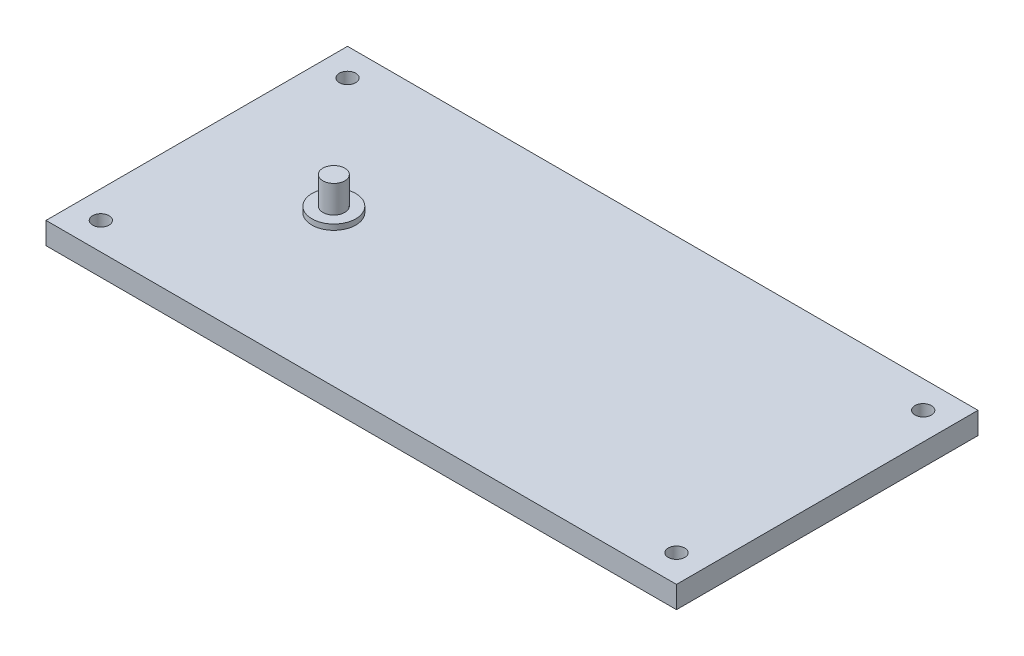
ISO-10303-21;
HEADER;
FILE_DESCRIPTION(('STEP AP214'),'2;1');
FILE_NAME('part.step','',(''),(''),'','','');
FILE_SCHEMA(('AUTOMOTIVE_DESIGN { 1 0 10303 214 1 1 1 1 }'));
ENDSEC;
DATA;
#1=APPLICATION_CONTEXT('core data for automotive mechanical design processes');
#2=APPLICATION_PROTOCOL_DEFINITION('international standard','automotive_design',2000,#1);
#3=PRODUCT_CONTEXT('',#1,'mechanical');
#4=PRODUCT('Part','Part','',(#3));
#5=PRODUCT_RELATED_PRODUCT_CATEGORY('part','',(#4));
#6=PRODUCT_DEFINITION_FORMATION('','',#4);
#7=PRODUCT_DEFINITION_CONTEXT('part definition',#1,'design');
#8=PRODUCT_DEFINITION('design','',#6,#7);
#9=PRODUCT_DEFINITION_SHAPE('','',#8);
#10=(LENGTH_UNIT() NAMED_UNIT(*) SI_UNIT(.MILLI.,.METRE.));
#11=(NAMED_UNIT(*) PLANE_ANGLE_UNIT() SI_UNIT($,.RADIAN.));
#12=(NAMED_UNIT(*) SI_UNIT($,.STERADIAN.) SOLID_ANGLE_UNIT());
#13=UNCERTAINTY_MEASURE_WITH_UNIT(LENGTH_MEASURE(1.E-05),#10,'distance_accuracy_value','');
#14=(GEOMETRIC_REPRESENTATION_CONTEXT(3) GLOBAL_UNCERTAINTY_ASSIGNED_CONTEXT((#13)) GLOBAL_UNIT_ASSIGNED_CONTEXT((#10,
#11,#12)) REPRESENTATION_CONTEXT('',''));
#15=CARTESIAN_POINT('',(0.,0.,0.));
#16=DIRECTION('',(0.,0.,1.));
#17=DIRECTION('',(1.,0.,0.));
#18=AXIS2_PLACEMENT_3D('',#15,#16,#17);
#19=CARTESIAN_POINT('',(115.,8.,-55.));
#20=DIRECTION('',(-1.,0.,0.));
#21=DIRECTION('',(0.,0.,1.));
#22=AXIS2_PLACEMENT_3D('',#19,#20,#21);
#23=PLANE('',#22);
#24=DIRECTION('',(0.,0.,-1.));
#25=VECTOR('',#24,1.);
#26=CARTESIAN_POINT('',(115.,0.,-55.));
#27=LINE('',#26,#25);
#28=CARTESIAN_POINT('',(115.,0.,55.));
#29=VERTEX_POINT('',#28);
#30=CARTESIAN_POINT('',(115.,0.,-55.));
#31=VERTEX_POINT('',#30);
#32=EDGE_CURVE('E101',#29,#31,#27,.T.);
#33=ORIENTED_EDGE('',*,*,#32,.T.);
#34=DIRECTION('',(0.,-1.,0.));
#35=VECTOR('',#34,1.);
#36=CARTESIAN_POINT('',(115.,8.,-55.));
#37=LINE('',#36,#35);
#38=CARTESIAN_POINT('',(115.,8.,-55.));
#39=VERTEX_POINT('',#38);
#40=EDGE_CURVE('E38',#39,#31,#37,.T.);
#41=ORIENTED_EDGE('',*,*,#40,.F.);
#42=DIRECTION('',(0.,0.,-1.));
#43=VECTOR('',#42,1.);
#44=CARTESIAN_POINT('',(115.,8.,-55.));
#45=LINE('',#44,#43);
#46=CARTESIAN_POINT('',(115.,8.,55.));
#47=VERTEX_POINT('',#46);
#48=EDGE_CURVE('E88',#47,#39,#45,.T.);
#49=ORIENTED_EDGE('',*,*,#48,.F.);
#50=DIRECTION('',(0.,-1.,0.));
#51=VECTOR('',#50,1.);
#52=CARTESIAN_POINT('',(115.,8.,55.));
#53=LINE('',#52,#51);
#54=EDGE_CURVE('E97',#47,#29,#53,.T.);
#55=ORIENTED_EDGE('',*,*,#54,.T.);
#56=EDGE_LOOP('',(#33,#41,#49,#55));
#57=FACE_BOUND('',#56,.T.);
#58=ADVANCED_FACE('F35',(#57),#23,.F.);
#59=CARTESIAN_POINT('',(-115.,8.,-55.));
#60=DIRECTION('',(0.,0.,1.));
#61=DIRECTION('',(1.,0.,0.));
#62=AXIS2_PLACEMENT_3D('',#59,#60,#61);
#63=PLANE('',#62);
#64=DIRECTION('',(-1.,0.,0.));
#65=VECTOR('',#64,1.);
#66=CARTESIAN_POINT('',(-115.,0.,-55.));
#67=LINE('',#66,#65);
#68=CARTESIAN_POINT('',(-115.,0.,-55.));
#69=VERTEX_POINT('',#68);
#70=EDGE_CURVE('E93',#31,#69,#67,.T.);
#71=ORIENTED_EDGE('',*,*,#70,.T.);
#72=DIRECTION('',(0.,-1.,0.));
#73=VECTOR('',#72,1.);
#74=CARTESIAN_POINT('',(-115.,8.,-55.));
#75=LINE('',#74,#73);
#76=CARTESIAN_POINT('',(-115.,8.,-55.));
#77=VERTEX_POINT('',#76);
#78=EDGE_CURVE('E91',#77,#69,#75,.T.);
#79=ORIENTED_EDGE('',*,*,#78,.F.);
#80=DIRECTION('',(-1.,0.,0.));
#81=VECTOR('',#80,1.);
#82=CARTESIAN_POINT('',(-115.,8.,-55.));
#83=LINE('',#82,#81);
#84=EDGE_CURVE('E83',#39,#77,#83,.T.);
#85=ORIENTED_EDGE('',*,*,#84,.F.);
#86=ORIENTED_EDGE('',*,*,#40,.T.);
#87=EDGE_LOOP('',(#71,#79,#85,#86));
#88=FACE_BOUND('',#87,.T.);
#89=ADVANCED_FACE('F92',(#88),#63,.F.);
#90=CARTESIAN_POINT('',(-115.,8.,-55.));
#91=DIRECTION('',(1.,0.,0.));
#92=DIRECTION('',(0.,0.,-1.));
#93=AXIS2_PLACEMENT_3D('',#90,#91,#92);
#94=PLANE('',#93);
#95=DIRECTION('',(0.,0.,1.));
#96=VECTOR('',#95,1.);
#97=CARTESIAN_POINT('',(-115.,0.,-55.));
#98=LINE('',#97,#96);
#99=CARTESIAN_POINT('',(-115.,0.,55.));
#100=VERTEX_POINT('',#99);
#101=EDGE_CURVE('E69',#69,#100,#98,.T.);
#102=ORIENTED_EDGE('',*,*,#101,.T.);
#103=DIRECTION('',(0.,-1.,0.));
#104=VECTOR('',#103,1.);
#105=CARTESIAN_POINT('',(-115.,8.,55.));
#106=LINE('',#105,#104);
#107=CARTESIAN_POINT('',(-115.,8.,55.));
#108=VERTEX_POINT('',#107);
#109=EDGE_CURVE('E94',#108,#100,#106,.T.);
#110=ORIENTED_EDGE('',*,*,#109,.F.);
#111=DIRECTION('',(0.,0.,1.));
#112=VECTOR('',#111,1.);
#113=CARTESIAN_POINT('',(-115.,8.,-55.));
#114=LINE('',#113,#112);
#115=EDGE_CURVE('E86',#77,#108,#114,.T.);
#116=ORIENTED_EDGE('',*,*,#115,.F.);
#117=ORIENTED_EDGE('',*,*,#78,.T.);
#118=EDGE_LOOP('',(#102,#110,#116,#117));
#119=FACE_BOUND('',#118,.T.);
#120=ADVANCED_FACE('F95',(#119),#94,.F.);
#121=CARTESIAN_POINT('',(-115.,8.,55.));
#122=DIRECTION('',(0.,0.,-1.));
#123=DIRECTION('',(-1.,0.,0.));
#124=AXIS2_PLACEMENT_3D('',#121,#122,#123);
#125=PLANE('',#124);
#126=DIRECTION('',(1.,0.,0.));
#127=VECTOR('',#126,1.);
#128=CARTESIAN_POINT('',(-115.,0.,55.));
#129=LINE('',#128,#127);
#130=EDGE_CURVE('E75',#100,#29,#129,.T.);
#131=ORIENTED_EDGE('',*,*,#130,.T.);
#132=ORIENTED_EDGE('',*,*,#54,.F.);
#133=DIRECTION('',(1.,0.,0.));
#134=VECTOR('',#133,1.);
#135=CARTESIAN_POINT('',(-115.,8.,55.));
#136=LINE('',#135,#134);
#137=EDGE_CURVE('E52',#108,#47,#136,.T.);
#138=ORIENTED_EDGE('',*,*,#137,.F.);
#139=ORIENTED_EDGE('',*,*,#109,.T.);
#140=EDGE_LOOP('',(#131,#132,#138,#139));
#141=FACE_BOUND('',#140,.T.);
#142=ADVANCED_FACE('F109',(#141),#125,.F.);
#143=CARTESIAN_POINT('',(0.,8.,0.));
#144=DIRECTION('',(0.,1.,0.));
#145=DIRECTION('',(0.,0.,1.));
#146=AXIS2_PLACEMENT_3D('',#143,#144,#145);
#147=PLANE('',#146);
#148=CARTESIAN_POINT('',(-105.,8.,45.));
#149=DIRECTION('',(0.,1.,0.));
#150=DIRECTION('',(0.,0.,1.));
#151=AXIS2_PLACEMENT_3D('',#148,#149,#150);
#152=CIRCLE('',#151,3.00000000000001);
#153=CARTESIAN_POINT('',(-105.,8.,48.));
#154=VERTEX_POINT('',#153);
#155=EDGE_CURVE('E137',#154,#154,#152,.T.);
#156=ORIENTED_EDGE('',*,*,#155,.F.);
#157=EDGE_LOOP('',(#156));
#158=FACE_BOUND('',#157,.T.);
#159=CARTESIAN_POINT('',(105.,8.,-45.));
#160=DIRECTION('',(0.,1.,0.));
#161=DIRECTION('',(0.,0.,1.));
#162=AXIS2_PLACEMENT_3D('',#159,#160,#161);
#163=CIRCLE('',#162,3.00000000000001);
#164=CARTESIAN_POINT('',(105.,8.,-42.));
#165=VERTEX_POINT('',#164);
#166=EDGE_CURVE('E130',#165,#165,#163,.T.);
#167=ORIENTED_EDGE('',*,*,#166,.F.);
#168=EDGE_LOOP('',(#167));
#169=FACE_BOUND('',#168,.T.);
#170=CARTESIAN_POINT('',(105.,8.,45.));
#171=DIRECTION('',(0.,1.,0.));
#172=DIRECTION('',(0.,0.,1.));
#173=AXIS2_PLACEMENT_3D('',#170,#171,#172);
#174=CIRCLE('',#173,3.00000000000001);
#175=CARTESIAN_POINT('',(105.,8.,48.));
#176=VERTEX_POINT('',#175);
#177=EDGE_CURVE('E142',#176,#176,#174,.T.);
#178=ORIENTED_EDGE('',*,*,#177,.F.);
#179=EDGE_LOOP('',(#178));
#180=FACE_BOUND('',#179,.T.);
#181=CARTESIAN_POINT('',(-105.,8.,-45.));
#182=DIRECTION('',(0.,1.,0.));
#183=DIRECTION('',(0.,0.,1.));
#184=AXIS2_PLACEMENT_3D('',#181,#182,#183);
#185=CIRCLE('',#184,3.00000000000001);
#186=CARTESIAN_POINT('',(-105.,8.,-42.));
#187=VERTEX_POINT('',#186);
#188=EDGE_CURVE('E124',#187,#187,#185,.T.);
#189=ORIENTED_EDGE('',*,*,#188,.F.);
#190=EDGE_LOOP('',(#189));
#191=FACE_BOUND('',#190,.T.);
#192=CARTESIAN_POINT('',(-65.,8.,0.));
#193=DIRECTION('',(0.,1.,0.));
#194=DIRECTION('',(0.,0.,1.));
#195=AXIS2_PLACEMENT_3D('',#192,#193,#194);
#196=CIRCLE('',#195,8.);
#197=CARTESIAN_POINT('',(-65.,8.,8.));
#198=VERTEX_POINT('',#197);
#199=EDGE_CURVE('E115',#198,#198,#196,.T.);
#200=ORIENTED_EDGE('',*,*,#199,.F.);
#201=EDGE_LOOP('',(#200));
#202=FACE_BOUND('',#201,.T.);
#203=ORIENTED_EDGE('',*,*,#48,.T.);
#204=ORIENTED_EDGE('',*,*,#84,.T.);
#205=ORIENTED_EDGE('',*,*,#115,.T.);
#206=ORIENTED_EDGE('',*,*,#137,.T.);
#207=EDGE_LOOP('',(#203,#204,#205,#206));
#208=FACE_BOUND('',#207,.T.);
#209=ADVANCED_FACE('F84',(#158,#169,#180,#191,#202,#208),#147,.T.);
#210=CARTESIAN_POINT('',(0.,0.,0.));
#211=DIRECTION('',(0.,1.,0.));
#212=DIRECTION('',(0.,0.,1.));
#213=AXIS2_PLACEMENT_3D('',#210,#211,#212);
#214=PLANE('',#213);
#215=CARTESIAN_POINT('',(-105.,0.,45.));
#216=DIRECTION('',(0.,1.,0.));
#217=DIRECTION('',(0.,0.,1.));
#218=AXIS2_PLACEMENT_3D('',#215,#216,#217);
#219=CIRCLE('',#218,3.00000000000001);
#220=CARTESIAN_POINT('',(-105.,0.,48.));
#221=VERTEX_POINT('',#220);
#222=EDGE_CURVE('E127',#221,#221,#219,.T.);
#223=ORIENTED_EDGE('',*,*,#222,.T.);
#224=EDGE_LOOP('',(#223));
#225=FACE_BOUND('',#224,.T.);
#226=CARTESIAN_POINT('',(105.,0.,-45.));
#227=DIRECTION('',(0.,1.,0.));
#228=DIRECTION('',(0.,0.,1.));
#229=AXIS2_PLACEMENT_3D('',#226,#227,#228);
#230=CIRCLE('',#229,3.00000000000001);
#231=CARTESIAN_POINT('',(105.,0.,-42.));
#232=VERTEX_POINT('',#231);
#233=EDGE_CURVE('E133',#232,#232,#230,.T.);
#234=ORIENTED_EDGE('',*,*,#233,.T.);
#235=EDGE_LOOP('',(#234));
#236=FACE_BOUND('',#235,.T.);
#237=CARTESIAN_POINT('',(105.,0.,45.));
#238=DIRECTION('',(0.,1.,0.));
#239=DIRECTION('',(0.,0.,1.));
#240=AXIS2_PLACEMENT_3D('',#237,#238,#239);
#241=CIRCLE('',#240,3.00000000000001);
#242=CARTESIAN_POINT('',(105.,0.,48.));
#243=VERTEX_POINT('',#242);
#244=EDGE_CURVE('E134',#243,#243,#241,.T.);
#245=ORIENTED_EDGE('',*,*,#244,.T.);
#246=EDGE_LOOP('',(#245));
#247=FACE_BOUND('',#246,.T.);
#248=CARTESIAN_POINT('',(-105.,0.,-45.));
#249=DIRECTION('',(0.,1.,0.));
#250=DIRECTION('',(0.,0.,1.));
#251=AXIS2_PLACEMENT_3D('',#248,#249,#250);
#252=CIRCLE('',#251,3.00000000000001);
#253=CARTESIAN_POINT('',(-105.,0.,-42.));
#254=VERTEX_POINT('',#253);
#255=EDGE_CURVE('E123',#254,#254,#252,.T.);
#256=ORIENTED_EDGE('',*,*,#255,.T.);
#257=EDGE_LOOP('',(#256));
#258=FACE_BOUND('',#257,.T.);
#259=ORIENTED_EDGE('',*,*,#32,.F.);
#260=ORIENTED_EDGE('',*,*,#130,.F.);
#261=ORIENTED_EDGE('',*,*,#101,.F.);
#262=ORIENTED_EDGE('',*,*,#70,.F.);
#263=EDGE_LOOP('',(#259,#260,#261,#262));
#264=FACE_BOUND('',#263,.T.);
#265=ADVANCED_FACE('F112',(#225,#236,#247,#258,#264),#214,.F.);
#266=CARTESIAN_POINT('',(-65.,10.,0.));
#267=DIRECTION('',(0.,-1.,0.));
#268=DIRECTION('',(0.,0.,-1.));
#269=AXIS2_PLACEMENT_3D('',#266,#267,#268);
#270=CYLINDRICAL_SURFACE('',#269,8.);
#271=CARTESIAN_POINT('',(-65.,10.,0.));
#272=DIRECTION('',(0.,1.,0.));
#273=DIRECTION('',(0.,0.,1.));
#274=AXIS2_PLACEMENT_3D('',#271,#272,#273);
#275=CIRCLE('',#274,8.);
#276=CARTESIAN_POINT('',(-65.,10.,8.));
#277=VERTEX_POINT('',#276);
#278=EDGE_CURVE('E104',#277,#277,#275,.T.);
#279=ORIENTED_EDGE('',*,*,#278,.F.);
#280=EDGE_LOOP('',(#279));
#281=FACE_BOUND('',#280,.T.);
#282=ORIENTED_EDGE('',*,*,#199,.T.);
#283=EDGE_LOOP('',(#282));
#284=FACE_BOUND('',#283,.T.);
#285=ADVANCED_FACE('F166',(#281,#284),#270,.T.);
#286=CARTESIAN_POINT('',(-65.,10.,0.));
#287=DIRECTION('',(0.,1.,0.));
#288=DIRECTION('',(0.,0.,1.));
#289=AXIS2_PLACEMENT_3D('',#286,#287,#288);
#290=PLANE('',#289);
#291=CARTESIAN_POINT('',(-65.,10.,0.));
#292=DIRECTION('',(0.,1.,0.));
#293=DIRECTION('',(0.,0.,1.));
#294=AXIS2_PLACEMENT_3D('',#291,#292,#293);
#295=CIRCLE('',#294,4.00000000000001);
#296=CARTESIAN_POINT('',(-65.,10.,4.00000000000001));
#297=VERTEX_POINT('',#296);
#298=EDGE_CURVE('E11',#297,#297,#295,.T.);
#299=ORIENTED_EDGE('',*,*,#298,.F.);
#300=EDGE_LOOP('',(#299));
#301=FACE_BOUND('',#300,.T.);
#302=ORIENTED_EDGE('',*,*,#278,.T.);
#303=EDGE_LOOP('',(#302));
#304=FACE_BOUND('',#303,.T.);
#305=ADVANCED_FACE('F168',(#301,#304),#290,.T.);
#306=CARTESIAN_POINT('',(-65.,20.,0.));
#307=DIRECTION('',(0.,-1.,0.));
#308=DIRECTION('',(0.,0.,-1.));
#309=AXIS2_PLACEMENT_3D('',#306,#307,#308);
#310=CYLINDRICAL_SURFACE('',#309,4.00000000000001);
#311=CARTESIAN_POINT('',(-65.,20.,0.));
#312=DIRECTION('',(0.,1.,0.));
#313=DIRECTION('',(0.,0.,1.));
#314=AXIS2_PLACEMENT_3D('',#311,#312,#313);
#315=CIRCLE('',#314,4.00000000000001);
#316=CARTESIAN_POINT('',(-65.,20.,4.00000000000001));
#317=VERTEX_POINT('',#316);
#318=EDGE_CURVE('E118',#317,#317,#315,.T.);
#319=ORIENTED_EDGE('',*,*,#318,.F.);
#320=EDGE_LOOP('',(#319));
#321=FACE_BOUND('',#320,.T.);
#322=ORIENTED_EDGE('',*,*,#298,.T.);
#323=EDGE_LOOP('',(#322));
#324=FACE_BOUND('',#323,.T.);
#325=ADVANCED_FACE('F175',(#321,#324),#310,.T.);
#326=CARTESIAN_POINT('',(-65.,20.,0.));
#327=DIRECTION('',(0.,1.,0.));
#328=DIRECTION('',(0.,0.,1.));
#329=AXIS2_PLACEMENT_3D('',#326,#327,#328);
#330=PLANE('',#329);
#331=ORIENTED_EDGE('',*,*,#318,.T.);
#332=EDGE_LOOP('',(#331));
#333=FACE_BOUND('',#332,.T.);
#334=ADVANCED_FACE('F214',(#333),#330,.T.);
#335=CARTESIAN_POINT('',(-105.,0.,-45.));
#336=DIRECTION('',(0.,1.,0.));
#337=DIRECTION('',(0.,0.,1.));
#338=AXIS2_PLACEMENT_3D('',#335,#336,#337);
#339=CYLINDRICAL_SURFACE('',#338,3.00000000000001);
#340=ORIENTED_EDGE('',*,*,#255,.F.);
#341=EDGE_LOOP('',(#340));
#342=FACE_BOUND('',#341,.T.);
#343=ORIENTED_EDGE('',*,*,#188,.T.);
#344=EDGE_LOOP('',(#343));
#345=FACE_BOUND('',#344,.T.);
#346=ADVANCED_FACE('F154',(#342,#345),#339,.F.);
#347=CARTESIAN_POINT('',(105.,0.,45.));
#348=DIRECTION('',(0.,1.,0.));
#349=DIRECTION('',(0.,0.,1.));
#350=AXIS2_PLACEMENT_3D('',#347,#348,#349);
#351=CYLINDRICAL_SURFACE('',#350,3.00000000000001);
#352=ORIENTED_EDGE('',*,*,#244,.F.);
#353=EDGE_LOOP('',(#352));
#354=FACE_BOUND('',#353,.T.);
#355=ORIENTED_EDGE('',*,*,#177,.T.);
#356=EDGE_LOOP('',(#355));
#357=FACE_BOUND('',#356,.T.);
#358=ADVANCED_FACE('F150',(#354,#357),#351,.F.);
#359=CARTESIAN_POINT('',(105.,0.,-45.));
#360=DIRECTION('',(0.,1.,0.));
#361=DIRECTION('',(0.,0.,1.));
#362=AXIS2_PLACEMENT_3D('',#359,#360,#361);
#363=CYLINDRICAL_SURFACE('',#362,3.00000000000001);
#364=ORIENTED_EDGE('',*,*,#233,.F.);
#365=EDGE_LOOP('',(#364));
#366=FACE_BOUND('',#365,.T.);
#367=ORIENTED_EDGE('',*,*,#166,.T.);
#368=EDGE_LOOP('',(#367));
#369=FACE_BOUND('',#368,.T.);
#370=ADVANCED_FACE('F153',(#366,#369),#363,.F.);
#371=CARTESIAN_POINT('',(-105.,0.,45.));
#372=DIRECTION('',(0.,1.,0.));
#373=DIRECTION('',(0.,0.,1.));
#374=AXIS2_PLACEMENT_3D('',#371,#372,#373);
#375=CYLINDRICAL_SURFACE('',#374,3.00000000000001);
#376=ORIENTED_EDGE('',*,*,#222,.F.);
#377=EDGE_LOOP('',(#376));
#378=FACE_BOUND('',#377,.T.);
#379=ORIENTED_EDGE('',*,*,#155,.T.);
#380=EDGE_LOOP('',(#379));
#381=FACE_BOUND('',#380,.T.);
#382=ADVANCED_FACE('F232',(#378,#381),#375,.F.);
#383=CLOSED_SHELL('',(#58,#89,#120,#142,#209,#265,#285,#305,#325,#334,#346,#358,#370,#382));
#384=MANIFOLD_SOLID_BREP('B2',#383);
#385=ADVANCED_BREP_SHAPE_REPRESENTATION('',(#18,#384),#14);
#386=SHAPE_DEFINITION_REPRESENTATION(#9,#385);
ENDSEC;
END-ISO-10303-21;
